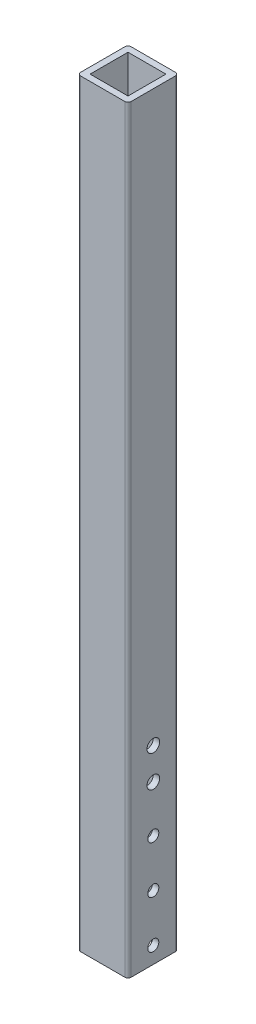
ISO-10303-21;
HEADER;
FILE_DESCRIPTION(('STEP AP214'),'2;1');
FILE_NAME('part.step','',(''),(''),'','','');
FILE_SCHEMA(('AUTOMOTIVE_DESIGN { 1 0 10303 214 1 1 1 1 }'));
ENDSEC;
DATA;
#1=APPLICATION_CONTEXT('core data for automotive mechanical design processes');
#2=APPLICATION_PROTOCOL_DEFINITION('international standard','automotive_design',2000,#1);
#3=PRODUCT_CONTEXT('',#1,'mechanical');
#4=PRODUCT('Part','Part','',(#3));
#5=PRODUCT_RELATED_PRODUCT_CATEGORY('part','',(#4));
#6=PRODUCT_DEFINITION_FORMATION('','',#4);
#7=PRODUCT_DEFINITION_CONTEXT('part definition',#1,'design');
#8=PRODUCT_DEFINITION('design','',#6,#7);
#9=PRODUCT_DEFINITION_SHAPE('','',#8);
#10=(LENGTH_UNIT() NAMED_UNIT(*) SI_UNIT(.MILLI.,.METRE.));
#11=(NAMED_UNIT(*) PLANE_ANGLE_UNIT() SI_UNIT($,.RADIAN.));
#12=(NAMED_UNIT(*) SI_UNIT($,.STERADIAN.) SOLID_ANGLE_UNIT());
#13=UNCERTAINTY_MEASURE_WITH_UNIT(LENGTH_MEASURE(1.E-05),#10,'distance_accuracy_value','');
#14=(GEOMETRIC_REPRESENTATION_CONTEXT(3) GLOBAL_UNCERTAINTY_ASSIGNED_CONTEXT((#13)) GLOBAL_UNIT_ASSIGNED_CONTEXT((#10,
#11,#12)) REPRESENTATION_CONTEXT('',''));
#15=CARTESIAN_POINT('',(0.,0.,0.));
#16=DIRECTION('',(0.,0.,1.));
#17=DIRECTION('',(1.,0.,0.));
#18=AXIS2_PLACEMENT_3D('',#15,#16,#17);
#19=CARTESIAN_POINT('',(0.,240.,0.));
#20=DIRECTION('',(0.,1.,0.));
#21=DIRECTION('',(0.,0.,1.));
#22=AXIS2_PLACEMENT_3D('',#19,#20,#21);
#23=PLANE('',#22);
#24=DIRECTION('',(0.,0.,1.));
#25=VECTOR('',#24,1.);
#26=CARTESIAN_POINT('',(-5.75438596491226,240.,-6.31578947368421));
#27=LINE('',#26,#25);
#28=CARTESIAN_POINT('',(-5.75438596491226,240.,-5.31578947368421));
#29=VERTEX_POINT('',#28);
#30=CARTESIAN_POINT('',(-5.75438596491226,240.,8.68421052631579));
#31=VERTEX_POINT('',#30);
#32=EDGE_CURVE('E194',#29,#31,#27,.T.);
#33=ORIENTED_EDGE('',*,*,#32,.T.);
#34=CARTESIAN_POINT('',(-4.75438596491226,240.,8.68421052631579));
#35=DIRECTION('',(0.,1.,0.));
#36=DIRECTION('',(0.,0.,1.));
#37=AXIS2_PLACEMENT_3D('',#34,#35,#36);
#38=CIRCLE('',#37,1.);
#39=CARTESIAN_POINT('',(-4.75438596491226,240.,9.68421052631579));
#40=VERTEX_POINT('',#39);
#41=EDGE_CURVE('E256',#31,#40,#38,.T.);
#42=ORIENTED_EDGE('',*,*,#41,.T.);
#43=DIRECTION('',(1.,0.,0.));
#44=VECTOR('',#43,1.);
#45=CARTESIAN_POINT('',(-5.75438596491226,240.,9.68421052631579));
#46=LINE('',#45,#44);
#47=CARTESIAN_POINT('',(9.24561403508774,240.,9.68421052631579));
#48=VERTEX_POINT('',#47);
#49=EDGE_CURVE('E198',#40,#48,#46,.T.);
#50=ORIENTED_EDGE('',*,*,#49,.T.);
#51=CARTESIAN_POINT('',(9.24561403508774,240.,8.68421052631579));
#52=DIRECTION('',(0.,1.,0.));
#53=DIRECTION('',(0.,0.,1.));
#54=AXIS2_PLACEMENT_3D('',#51,#52,#53);
#55=CIRCLE('',#54,1.);
#56=CARTESIAN_POINT('',(10.2456140350877,240.,8.68421052631579));
#57=VERTEX_POINT('',#56);
#58=EDGE_CURVE('E250',#48,#57,#55,.T.);
#59=ORIENTED_EDGE('',*,*,#58,.T.);
#60=DIRECTION('',(0.,0.,-1.));
#61=VECTOR('',#60,1.);
#62=CARTESIAN_POINT('',(10.2456140350877,240.,-6.31578947368421));
#63=LINE('',#62,#61);
#64=CARTESIAN_POINT('',(10.2456140350877,240.,-5.31578947368421));
#65=VERTEX_POINT('',#64);
#66=EDGE_CURVE('E203',#57,#65,#63,.T.);
#67=ORIENTED_EDGE('',*,*,#66,.T.);
#68=CARTESIAN_POINT('',(9.24561403508774,240.,-5.31578947368421));
#69=DIRECTION('',(0.,1.,0.));
#70=DIRECTION('',(0.,0.,1.));
#71=AXIS2_PLACEMENT_3D('',#68,#69,#70);
#72=CIRCLE('',#71,1.);
#73=CARTESIAN_POINT('',(9.24561403508774,240.,-6.31578947368421));
#74=VERTEX_POINT('',#73);
#75=EDGE_CURVE('E69',#65,#74,#72,.T.);
#76=ORIENTED_EDGE('',*,*,#75,.T.);
#77=DIRECTION('',(-1.,0.,0.));
#78=VECTOR('',#77,1.);
#79=CARTESIAN_POINT('',(-5.75438596491226,240.,-6.31578947368421));
#80=LINE('',#79,#78);
#81=CARTESIAN_POINT('',(-4.75438596491226,240.,-6.31578947368421));
#82=VERTEX_POINT('',#81);
#83=EDGE_CURVE('E206',#74,#82,#80,.T.);
#84=ORIENTED_EDGE('',*,*,#83,.T.);
#85=CARTESIAN_POINT('',(-4.75438596491226,240.,-5.31578947368421));
#86=DIRECTION('',(0.,1.,0.));
#87=DIRECTION('',(0.,0.,1.));
#88=AXIS2_PLACEMENT_3D('',#85,#86,#87);
#89=CIRCLE('',#88,1.);
#90=EDGE_CURVE('E253',#82,#29,#89,.T.);
#91=ORIENTED_EDGE('',*,*,#90,.T.);
#92=EDGE_LOOP('',(#33,#42,#50,#59,#67,#76,#84,#91));
#93=FACE_BOUND('',#92,.T.);
#94=DIRECTION('',(0.,0.,1.));
#95=VECTOR('',#94,1.);
#96=CARTESIAN_POINT('',(-3.75438596491226,240.,-4.31578947368421));
#97=LINE('',#96,#95);
#98=CARTESIAN_POINT('',(-3.75438596491226,240.,-4.31578947368421));
#99=VERTEX_POINT('',#98);
#100=CARTESIAN_POINT('',(-3.75438596491226,240.,7.68421052631579));
#101=VERTEX_POINT('',#100);
#102=EDGE_CURVE('E150',#99,#101,#97,.T.);
#103=ORIENTED_EDGE('',*,*,#102,.F.);
#104=DIRECTION('',(-1.,0.,0.));
#105=VECTOR('',#104,1.);
#106=CARTESIAN_POINT('',(-3.75438596491226,240.,-4.31578947368421));
#107=LINE('',#106,#105);
#108=CARTESIAN_POINT('',(8.24561403508774,240.,-4.31578947368421));
#109=VERTEX_POINT('',#108);
#110=EDGE_CURVE('E139',#109,#99,#107,.T.);
#111=ORIENTED_EDGE('',*,*,#110,.F.);
#112=DIRECTION('',(0.,0.,-1.));
#113=VECTOR('',#112,1.);
#114=CARTESIAN_POINT('',(8.24561403508774,240.,-4.31578947368421));
#115=LINE('',#114,#113);
#116=CARTESIAN_POINT('',(8.24561403508774,240.,7.68421052631579));
#117=VERTEX_POINT('',#116);
#118=EDGE_CURVE('E168',#117,#109,#115,.T.);
#119=ORIENTED_EDGE('',*,*,#118,.F.);
#120=DIRECTION('',(1.,0.,0.));
#121=VECTOR('',#120,1.);
#122=CARTESIAN_POINT('',(-3.75438596491226,240.,7.68421052631579));
#123=LINE('',#122,#121);
#124=EDGE_CURVE('E164',#101,#117,#123,.T.);
#125=ORIENTED_EDGE('',*,*,#124,.F.);
#126=EDGE_LOOP('',(#103,#111,#119,#125));
#127=FACE_BOUND('',#126,.T.);
#128=ADVANCED_FACE('F44',(#93,#127),#23,.T.);
#129=CARTESIAN_POINT('',(0.,0.,0.));
#130=DIRECTION('',(0.,1.,0.));
#131=DIRECTION('',(0.,0.,1.));
#132=AXIS2_PLACEMENT_3D('',#129,#130,#131);
#133=PLANE('',#132);
#134=DIRECTION('',(1.,0.,0.));
#135=VECTOR('',#134,1.);
#136=CARTESIAN_POINT('',(-5.75438596491226,0.,9.68421052631579));
#137=LINE('',#136,#135);
#138=CARTESIAN_POINT('',(-4.75438596491226,0.,9.68421052631579));
#139=VERTEX_POINT('',#138);
#140=CARTESIAN_POINT('',(9.24561403508774,0.,9.68421052631579));
#141=VERTEX_POINT('',#140);
#142=EDGE_CURVE('E213',#139,#141,#137,.T.);
#143=ORIENTED_EDGE('',*,*,#142,.F.);
#144=CARTESIAN_POINT('',(-4.75438596491226,0.,8.68421052631579));
#145=DIRECTION('',(0.,1.,0.));
#146=DIRECTION('',(0.,0.,1.));
#147=AXIS2_PLACEMENT_3D('',#144,#145,#146);
#148=CIRCLE('',#147,1.);
#149=CARTESIAN_POINT('',(-5.75438596491226,0.,8.68421052631579));
#150=VERTEX_POINT('',#149);
#151=EDGE_CURVE('E238',#139,#150,#148,.F.);
#152=ORIENTED_EDGE('',*,*,#151,.T.);
#153=DIRECTION('',(0.,0.,1.));
#154=VECTOR('',#153,1.);
#155=CARTESIAN_POINT('',(-5.75438596491226,0.,-6.31578947368421));
#156=LINE('',#155,#154);
#157=CARTESIAN_POINT('',(-5.75438596491226,0.,-5.31578947368421));
#158=VERTEX_POINT('',#157);
#159=EDGE_CURVE('E159',#158,#150,#156,.T.);
#160=ORIENTED_EDGE('',*,*,#159,.F.);
#161=CARTESIAN_POINT('',(-4.75438596491226,0.,-5.31578947368421));
#162=DIRECTION('',(0.,1.,0.));
#163=DIRECTION('',(0.,0.,1.));
#164=AXIS2_PLACEMENT_3D('',#161,#162,#163);
#165=CIRCLE('',#164,1.);
#166=CARTESIAN_POINT('',(-4.75438596491226,0.,-6.31578947368421));
#167=VERTEX_POINT('',#166);
#168=EDGE_CURVE('E235',#158,#167,#165,.F.);
#169=ORIENTED_EDGE('',*,*,#168,.T.);
#170=DIRECTION('',(-1.,0.,0.));
#171=VECTOR('',#170,1.);
#172=CARTESIAN_POINT('',(-5.75438596491226,0.,-6.31578947368421));
#173=LINE('',#172,#171);
#174=CARTESIAN_POINT('',(9.24561403508774,0.,-6.31578947368421));
#175=VERTEX_POINT('',#174);
#176=EDGE_CURVE('E199',#175,#167,#173,.T.);
#177=ORIENTED_EDGE('',*,*,#176,.F.);
#178=CARTESIAN_POINT('',(9.24561403508774,0.,-5.31578947368421));
#179=DIRECTION('',(0.,1.,0.));
#180=DIRECTION('',(0.,0.,1.));
#181=AXIS2_PLACEMENT_3D('',#178,#179,#180);
#182=CIRCLE('',#181,1.);
#183=CARTESIAN_POINT('',(10.2456140350877,0.,-5.31578947368421));
#184=VERTEX_POINT('',#183);
#185=EDGE_CURVE('E229',#175,#184,#182,.F.);
#186=ORIENTED_EDGE('',*,*,#185,.T.);
#187=DIRECTION('',(0.,0.,-1.));
#188=VECTOR('',#187,1.);
#189=CARTESIAN_POINT('',(10.2456140350877,0.,-6.31578947368421));
#190=LINE('',#189,#188);
#191=CARTESIAN_POINT('',(10.2456140350877,0.,8.68421052631579));
#192=VERTEX_POINT('',#191);
#193=EDGE_CURVE('E217',#192,#184,#190,.T.);
#194=ORIENTED_EDGE('',*,*,#193,.F.);
#195=CARTESIAN_POINT('',(9.24561403508774,0.,8.68421052631579));
#196=DIRECTION('',(0.,1.,0.));
#197=DIRECTION('',(0.,0.,1.));
#198=AXIS2_PLACEMENT_3D('',#195,#196,#197);
#199=CIRCLE('',#198,1.);
#200=EDGE_CURVE('E232',#192,#141,#199,.F.);
#201=ORIENTED_EDGE('',*,*,#200,.T.);
#202=EDGE_LOOP('',(#143,#152,#160,#169,#177,#186,#194,#201));
#203=FACE_BOUND('',#202,.T.);
#204=DIRECTION('',(-1.,0.,0.));
#205=VECTOR('',#204,1.);
#206=CARTESIAN_POINT('',(-3.75438596491226,0.,-4.31578947368421));
#207=LINE('',#206,#205);
#208=CARTESIAN_POINT('',(8.24561403508774,0.,-4.31578947368421));
#209=VERTEX_POINT('',#208);
#210=CARTESIAN_POINT('',(-3.75438596491226,0.,-4.31578947368421));
#211=VERTEX_POINT('',#210);
#212=EDGE_CURVE('E174',#209,#211,#207,.T.);
#213=ORIENTED_EDGE('',*,*,#212,.T.);
#214=DIRECTION('',(0.,0.,1.));
#215=VECTOR('',#214,1.);
#216=CARTESIAN_POINT('',(-3.75438596491226,0.,-4.31578947368421));
#217=LINE('',#216,#215);
#218=CARTESIAN_POINT('',(-3.75438596491226,0.,7.68421052631579));
#219=VERTEX_POINT('',#218);
#220=EDGE_CURVE('E157',#211,#219,#217,.T.);
#221=ORIENTED_EDGE('',*,*,#220,.T.);
#222=DIRECTION('',(1.,0.,0.));
#223=VECTOR('',#222,1.);
#224=CARTESIAN_POINT('',(-3.75438596491226,0.,7.68421052631579));
#225=LINE('',#224,#223);
#226=CARTESIAN_POINT('',(8.24561403508774,0.,7.68421052631579));
#227=VERTEX_POINT('',#226);
#228=EDGE_CURVE('E180',#219,#227,#225,.T.);
#229=ORIENTED_EDGE('',*,*,#228,.T.);
#230=DIRECTION('',(0.,0.,-1.));
#231=VECTOR('',#230,1.);
#232=CARTESIAN_POINT('',(8.24561403508774,0.,-4.31578947368421));
#233=LINE('',#232,#231);
#234=EDGE_CURVE('E151',#227,#209,#233,.T.);
#235=ORIENTED_EDGE('',*,*,#234,.T.);
#236=EDGE_LOOP('',(#213,#221,#229,#235));
#237=FACE_BOUND('',#236,.T.);
#238=ADVANCED_FACE('F370',(#203,#237),#133,.F.);
#239=CARTESIAN_POINT('',(-5.75438596491226,240.,-6.31578947368421));
#240=DIRECTION('',(1.,0.,0.));
#241=DIRECTION('',(0.,0.,-1.));
#242=AXIS2_PLACEMENT_3D('',#239,#240,#241);
#243=PLANE('',#242);
#244=CARTESIAN_POINT('',(-5.75438596491226,60.,1.68421052631579));
#245=DIRECTION('',(1.,0.,0.));
#246=DIRECTION('',(0.,0.,-1.));
#247=AXIS2_PLACEMENT_3D('',#244,#245,#246);
#248=CIRCLE('',#247,2.);
#249=CARTESIAN_POINT('',(-5.75438596491226,60.,-0.315789473684212));
#250=VERTEX_POINT('',#249);
#251=EDGE_CURVE('E312',#250,#250,#248,.T.);
#252=ORIENTED_EDGE('',*,*,#251,.T.);
#253=EDGE_LOOP('',(#252));
#254=FACE_BOUND('',#253,.T.);
#255=CARTESIAN_POINT('',(-5.75438596491226,50.,1.68421052631579));
#256=DIRECTION('',(1.,0.,0.));
#257=DIRECTION('',(0.,0.,-1.));
#258=AXIS2_PLACEMENT_3D('',#255,#256,#257);
#259=CIRCLE('',#258,2.);
#260=CARTESIAN_POINT('',(-5.75438596491226,50.,-0.315789473684212));
#261=VERTEX_POINT('',#260);
#262=EDGE_CURVE('E294',#261,#261,#259,.T.);
#263=ORIENTED_EDGE('',*,*,#262,.T.);
#264=EDGE_LOOP('',(#263));
#265=FACE_BOUND('',#264,.T.);
#266=CARTESIAN_POINT('',(-5.75438596491226,35.25,1.68421052631579));
#267=DIRECTION('',(1.,0.,0.));
#268=DIRECTION('',(0.,0.,-1.));
#269=AXIS2_PLACEMENT_3D('',#266,#267,#268);
#270=CIRCLE('',#269,1.75);
#271=CARTESIAN_POINT('',(-5.75438596491226,35.25,-0.0657894736842137));
#272=VERTEX_POINT('',#271);
#273=EDGE_CURVE('E177',#272,#272,#270,.T.);
#274=ORIENTED_EDGE('',*,*,#273,.T.);
#275=EDGE_LOOP('',(#274));
#276=FACE_BOUND('',#275,.T.);
#277=CARTESIAN_POINT('',(-5.75438596491226,5.25,1.68421052631579));
#278=DIRECTION('',(1.,0.,0.));
#279=DIRECTION('',(0.,0.,-1.));
#280=AXIS2_PLACEMENT_3D('',#277,#278,#279);
#281=CIRCLE('',#280,1.75);
#282=CARTESIAN_POINT('',(-5.75438596491226,5.25,-0.0657894736842126));
#283=VERTEX_POINT('',#282);
#284=EDGE_CURVE('E283',#283,#283,#281,.T.);
#285=ORIENTED_EDGE('',*,*,#284,.T.);
#286=EDGE_LOOP('',(#285));
#287=FACE_BOUND('',#286,.T.);
#288=CARTESIAN_POINT('',(-5.75438596491226,20.25,1.68421052631579));
#289=DIRECTION('',(1.,0.,0.));
#290=DIRECTION('',(0.,0.,-1.));
#291=AXIS2_PLACEMENT_3D('',#288,#289,#290);
#292=CIRCLE('',#291,1.75);
#293=CARTESIAN_POINT('',(-5.75438596491226,20.25,-0.0657894736842142));
#294=VERTEX_POINT('',#293);
#295=EDGE_CURVE('E278',#294,#294,#292,.T.);
#296=ORIENTED_EDGE('',*,*,#295,.T.);
#297=EDGE_LOOP('',(#296));
#298=FACE_BOUND('',#297,.T.);
#299=ORIENTED_EDGE('',*,*,#159,.T.);
#300=DIRECTION('',(0.,-1.,0.));
#301=VECTOR('',#300,1.);
#302=CARTESIAN_POINT('',(-5.75438596491226,240.,8.68421052631579));
#303=LINE('',#302,#301);
#304=EDGE_CURVE('E245',#150,#31,#303,.F.);
#305=ORIENTED_EDGE('',*,*,#304,.T.);
#306=ORIENTED_EDGE('',*,*,#32,.F.);
#307=DIRECTION('',(0.,-1.,0.));
#308=VECTOR('',#307,1.);
#309=CARTESIAN_POINT('',(-5.75438596491226,240.,-5.31578947368421));
#310=LINE('',#309,#308);
#311=EDGE_CURVE('E241',#29,#158,#310,.T.);
#312=ORIENTED_EDGE('',*,*,#311,.T.);
#313=EDGE_LOOP('',(#299,#305,#306,#312));
#314=FACE_BOUND('',#313,.T.);
#315=ADVANCED_FACE('F345',(#254,#265,#276,#287,#298,#314),#243,.F.);
#316=CARTESIAN_POINT('',(-5.75438596491226,240.,9.68421052631579));
#317=DIRECTION('',(0.,0.,-1.));
#318=DIRECTION('',(-1.,0.,0.));
#319=AXIS2_PLACEMENT_3D('',#316,#317,#318);
#320=PLANE('',#319);
#321=ORIENTED_EDGE('',*,*,#49,.F.);
#322=DIRECTION('',(0.,-1.,0.));
#323=VECTOR('',#322,1.);
#324=CARTESIAN_POINT('',(-4.75438596491226,240.,9.68421052631579));
#325=LINE('',#324,#323);
#326=EDGE_CURVE('E225',#40,#139,#325,.T.);
#327=ORIENTED_EDGE('',*,*,#326,.T.);
#328=ORIENTED_EDGE('',*,*,#142,.T.);
#329=DIRECTION('',(0.,-1.,0.));
#330=VECTOR('',#329,1.);
#331=CARTESIAN_POINT('',(9.24561403508774,240.,9.68421052631579));
#332=LINE('',#331,#330);
#333=EDGE_CURVE('E209',#141,#48,#332,.F.);
#334=ORIENTED_EDGE('',*,*,#333,.T.);
#335=EDGE_LOOP('',(#321,#327,#328,#334));
#336=FACE_BOUND('',#335,.T.);
#337=ADVANCED_FACE('F387',(#336),#320,.F.);
#338=CARTESIAN_POINT('',(10.2456140350877,240.,-6.31578947368421));
#339=DIRECTION('',(-1.,0.,0.));
#340=DIRECTION('',(0.,0.,1.));
#341=AXIS2_PLACEMENT_3D('',#338,#339,#340);
#342=PLANE('',#341);
#343=CARTESIAN_POINT('',(10.2456140350877,60.,1.68421052631579));
#344=DIRECTION('',(1.,0.,0.));
#345=DIRECTION('',(0.,0.,-1.));
#346=AXIS2_PLACEMENT_3D('',#343,#344,#345);
#347=CIRCLE('',#346,2.);
#348=CARTESIAN_POINT('',(10.2456140350877,60.,-0.315789473684212));
#349=VERTEX_POINT('',#348);
#350=EDGE_CURVE('E288',#349,#349,#347,.T.);
#351=ORIENTED_EDGE('',*,*,#350,.F.);
#352=EDGE_LOOP('',(#351));
#353=FACE_BOUND('',#352,.T.);
#354=CARTESIAN_POINT('',(10.2456140350877,50.,1.68421052631579));
#355=DIRECTION('',(1.,0.,0.));
#356=DIRECTION('',(0.,0.,-1.));
#357=AXIS2_PLACEMENT_3D('',#354,#355,#356);
#358=CIRCLE('',#357,2.);
#359=CARTESIAN_POINT('',(10.2456140350877,50.,-0.315789473684212));
#360=VERTEX_POINT('',#359);
#361=EDGE_CURVE('E297',#360,#360,#358,.T.);
#362=ORIENTED_EDGE('',*,*,#361,.F.);
#363=EDGE_LOOP('',(#362));
#364=FACE_BOUND('',#363,.T.);
#365=CARTESIAN_POINT('',(10.2456140350877,35.25,1.68421052631579));
#366=DIRECTION('',(1.,0.,0.));
#367=DIRECTION('',(0.,0.,-1.));
#368=AXIS2_PLACEMENT_3D('',#365,#366,#367);
#369=CIRCLE('',#368,1.75);
#370=CARTESIAN_POINT('',(10.2456140350877,35.25,-0.0657894736842137));
#371=VERTEX_POINT('',#370);
#372=EDGE_CURVE('E272',#371,#371,#369,.T.);
#373=ORIENTED_EDGE('',*,*,#372,.F.);
#374=EDGE_LOOP('',(#373));
#375=FACE_BOUND('',#374,.T.);
#376=CARTESIAN_POINT('',(10.2456140350877,5.25,1.68421052631579));
#377=DIRECTION('',(1.,0.,0.));
#378=DIRECTION('',(0.,0.,-1.));
#379=AXIS2_PLACEMENT_3D('',#376,#377,#378);
#380=CIRCLE('',#379,1.75);
#381=CARTESIAN_POINT('',(10.2456140350877,5.25,-0.0657894736842126));
#382=VERTEX_POINT('',#381);
#383=EDGE_CURVE('E320',#382,#382,#380,.T.);
#384=ORIENTED_EDGE('',*,*,#383,.F.);
#385=EDGE_LOOP('',(#384));
#386=FACE_BOUND('',#385,.T.);
#387=CARTESIAN_POINT('',(10.2456140350877,20.25,1.68421052631579));
#388=DIRECTION('',(1.,0.,0.));
#389=DIRECTION('',(0.,0.,-1.));
#390=AXIS2_PLACEMENT_3D('',#387,#388,#389);
#391=CIRCLE('',#390,1.75);
#392=CARTESIAN_POINT('',(10.2456140350877,20.25,-0.0657894736842142));
#393=VERTEX_POINT('',#392);
#394=EDGE_CURVE('E316',#393,#393,#391,.T.);
#395=ORIENTED_EDGE('',*,*,#394,.F.);
#396=EDGE_LOOP('',(#395));
#397=FACE_BOUND('',#396,.T.);
#398=ORIENTED_EDGE('',*,*,#66,.F.);
#399=DIRECTION('',(0.,-1.,0.));
#400=VECTOR('',#399,1.);
#401=CARTESIAN_POINT('',(10.2456140350877,240.,8.68421052631579));
#402=LINE('',#401,#400);
#403=EDGE_CURVE('E11',#57,#192,#402,.T.);
#404=ORIENTED_EDGE('',*,*,#403,.T.);
#405=ORIENTED_EDGE('',*,*,#193,.T.);
#406=DIRECTION('',(0.,-1.,0.));
#407=VECTOR('',#406,1.);
#408=CARTESIAN_POINT('',(10.2456140350877,240.,-5.31578947368421));
#409=LINE('',#408,#407);
#410=EDGE_CURVE('E54',#184,#65,#409,.F.);
#411=ORIENTED_EDGE('',*,*,#410,.T.);
#412=EDGE_LOOP('',(#398,#404,#405,#411));
#413=FACE_BOUND('',#412,.T.);
#414=ADVANCED_FACE('F384',(#353,#364,#375,#386,#397,#413),#342,.F.);
#415=CARTESIAN_POINT('',(-5.75438596491226,240.,-6.31578947368421));
#416=DIRECTION('',(0.,0.,1.));
#417=DIRECTION('',(1.,0.,0.));
#418=AXIS2_PLACEMENT_3D('',#415,#416,#417);
#419=PLANE('',#418);
#420=ORIENTED_EDGE('',*,*,#176,.T.);
#421=DIRECTION('',(0.,-1.,0.));
#422=VECTOR('',#421,1.);
#423=CARTESIAN_POINT('',(-4.75438596491226,240.,-6.31578947368421));
#424=LINE('',#423,#422);
#425=EDGE_CURVE('E62',#167,#82,#424,.F.);
#426=ORIENTED_EDGE('',*,*,#425,.T.);
#427=ORIENTED_EDGE('',*,*,#83,.F.);
#428=DIRECTION('',(0.,-1.,0.));
#429=VECTOR('',#428,1.);
#430=CARTESIAN_POINT('',(9.24561403508774,240.,-6.31578947368421));
#431=LINE('',#430,#429);
#432=EDGE_CURVE('E259',#74,#175,#431,.T.);
#433=ORIENTED_EDGE('',*,*,#432,.T.);
#434=EDGE_LOOP('',(#420,#426,#427,#433));
#435=FACE_BOUND('',#434,.T.);
#436=ADVANCED_FACE('F381',(#435),#419,.F.);
#437=CARTESIAN_POINT('',(-3.75438596491226,240.,-4.31578947368421));
#438=DIRECTION('',(0.,0.,1.));
#439=DIRECTION('',(1.,0.,0.));
#440=AXIS2_PLACEMENT_3D('',#437,#438,#439);
#441=PLANE('',#440);
#442=ORIENTED_EDGE('',*,*,#212,.F.);
#443=DIRECTION('',(0.,-1.,0.));
#444=VECTOR('',#443,1.);
#445=CARTESIAN_POINT('',(8.24561403508774,240.,-4.31578947368421));
#446=LINE('',#445,#444);
#447=EDGE_CURVE('E145',#109,#209,#446,.T.);
#448=ORIENTED_EDGE('',*,*,#447,.F.);
#449=ORIENTED_EDGE('',*,*,#110,.T.);
#450=DIRECTION('',(0.,-1.,0.));
#451=VECTOR('',#450,1.);
#452=CARTESIAN_POINT('',(-3.75438596491226,240.,-4.31578947368421));
#453=LINE('',#452,#451);
#454=EDGE_CURVE('E142',#99,#211,#453,.T.);
#455=ORIENTED_EDGE('',*,*,#454,.T.);
#456=EDGE_LOOP('',(#442,#448,#449,#455));
#457=FACE_BOUND('',#456,.T.);
#458=ADVANCED_FACE('F141',(#457),#441,.T.);
#459=CARTESIAN_POINT('',(-3.75438596491226,240.,-4.31578947368421));
#460=DIRECTION('',(1.,0.,0.));
#461=DIRECTION('',(0.,0.,-1.));
#462=AXIS2_PLACEMENT_3D('',#459,#460,#461);
#463=PLANE('',#462);
#464=CARTESIAN_POINT('',(-3.75438596491226,60.,1.68421052631579));
#465=DIRECTION('',(1.,0.,0.));
#466=DIRECTION('',(0.,0.,-1.));
#467=AXIS2_PLACEMENT_3D('',#464,#465,#466);
#468=CIRCLE('',#467,2.);
#469=CARTESIAN_POINT('',(-3.75438596491226,60.,-0.315789473684212));
#470=VERTEX_POINT('',#469);
#471=EDGE_CURVE('E308',#470,#470,#468,.T.);
#472=ORIENTED_EDGE('',*,*,#471,.F.);
#473=EDGE_LOOP('',(#472));
#474=FACE_BOUND('',#473,.T.);
#475=CARTESIAN_POINT('',(-3.75438596491226,50.,1.68421052631579));
#476=DIRECTION('',(1.,0.,0.));
#477=DIRECTION('',(0.,0.,-1.));
#478=AXIS2_PLACEMENT_3D('',#475,#476,#477);
#479=CIRCLE('',#478,2.);
#480=CARTESIAN_POINT('',(-3.75438596491226,50.,-0.315789473684212));
#481=VERTEX_POINT('',#480);
#482=EDGE_CURVE('E287',#481,#481,#479,.T.);
#483=ORIENTED_EDGE('',*,*,#482,.F.);
#484=EDGE_LOOP('',(#483));
#485=FACE_BOUND('',#484,.T.);
#486=CARTESIAN_POINT('',(-3.75438596491226,35.25,1.68421052631579));
#487=DIRECTION('',(1.,0.,0.));
#488=DIRECTION('',(0.,0.,-1.));
#489=AXIS2_PLACEMENT_3D('',#486,#487,#488);
#490=CIRCLE('',#489,1.75);
#491=CARTESIAN_POINT('',(-3.75438596491226,35.25,-0.0657894736842137));
#492=VERTEX_POINT('',#491);
#493=EDGE_CURVE('E282',#492,#492,#490,.T.);
#494=ORIENTED_EDGE('',*,*,#493,.F.);
#495=EDGE_LOOP('',(#494));
#496=FACE_BOUND('',#495,.T.);
#497=CARTESIAN_POINT('',(-3.75438596491226,5.25,1.68421052631579));
#498=DIRECTION('',(1.,0.,0.));
#499=DIRECTION('',(0.,0.,-1.));
#500=AXIS2_PLACEMENT_3D('',#497,#498,#499);
#501=CIRCLE('',#500,1.75);
#502=CARTESIAN_POINT('',(-3.75438596491226,5.25,-0.0657894736842126));
#503=VERTEX_POINT('',#502);
#504=EDGE_CURVE('E277',#503,#503,#501,.T.);
#505=ORIENTED_EDGE('',*,*,#504,.F.);
#506=EDGE_LOOP('',(#505));
#507=FACE_BOUND('',#506,.T.);
#508=CARTESIAN_POINT('',(-3.75438596491226,20.25,1.68421052631579));
#509=DIRECTION('',(1.,0.,0.));
#510=DIRECTION('',(0.,0.,-1.));
#511=AXIS2_PLACEMENT_3D('',#508,#509,#510);
#512=CIRCLE('',#511,1.75);
#513=CARTESIAN_POINT('',(-3.75438596491226,20.25,-0.0657894736842142));
#514=VERTEX_POINT('',#513);
#515=EDGE_CURVE('E271',#514,#514,#512,.T.);
#516=ORIENTED_EDGE('',*,*,#515,.F.);
#517=EDGE_LOOP('',(#516));
#518=FACE_BOUND('',#517,.T.);
#519=ORIENTED_EDGE('',*,*,#220,.F.);
#520=ORIENTED_EDGE('',*,*,#454,.F.);
#521=ORIENTED_EDGE('',*,*,#102,.T.);
#522=DIRECTION('',(0.,-1.,0.));
#523=VECTOR('',#522,1.);
#524=CARTESIAN_POINT('',(-3.75438596491226,240.,7.68421052631579));
#525=LINE('',#524,#523);
#526=EDGE_CURVE('E160',#101,#219,#525,.T.);
#527=ORIENTED_EDGE('',*,*,#526,.T.);
#528=EDGE_LOOP('',(#519,#520,#521,#527));
#529=FACE_BOUND('',#528,.T.);
#530=ADVANCED_FACE('F154',(#474,#485,#496,#507,#518,#529),#463,.T.);
#531=CARTESIAN_POINT('',(-3.75438596491226,240.,7.68421052631579));
#532=DIRECTION('',(0.,0.,-1.));
#533=DIRECTION('',(-1.,0.,0.));
#534=AXIS2_PLACEMENT_3D('',#531,#532,#533);
#535=PLANE('',#534);
#536=ORIENTED_EDGE('',*,*,#228,.F.);
#537=ORIENTED_EDGE('',*,*,#526,.F.);
#538=ORIENTED_EDGE('',*,*,#124,.T.);
#539=DIRECTION('',(0.,-1.,0.));
#540=VECTOR('',#539,1.);
#541=CARTESIAN_POINT('',(8.24561403508774,240.,7.68421052631579));
#542=LINE('',#541,#540);
#543=EDGE_CURVE('E189',#117,#227,#542,.T.);
#544=ORIENTED_EDGE('',*,*,#543,.T.);
#545=EDGE_LOOP('',(#536,#537,#538,#544));
#546=FACE_BOUND('',#545,.T.);
#547=ADVANCED_FACE('F434',(#546),#535,.T.);
#548=CARTESIAN_POINT('',(8.24561403508774,240.,-4.31578947368421));
#549=DIRECTION('',(-1.,0.,0.));
#550=DIRECTION('',(0.,0.,1.));
#551=AXIS2_PLACEMENT_3D('',#548,#549,#550);
#552=PLANE('',#551);
#553=CARTESIAN_POINT('',(8.24561403508774,60.,1.68421052631579));
#554=DIRECTION('',(-1.,0.,0.));
#555=DIRECTION('',(0.,0.,1.));
#556=AXIS2_PLACEMENT_3D('',#553,#554,#555);
#557=CIRCLE('',#556,2.);
#558=CARTESIAN_POINT('',(8.24561403508774,60.,3.68421052631579));
#559=VERTEX_POINT('',#558);
#560=EDGE_CURVE('E48',#559,#559,#557,.T.);
#561=ORIENTED_EDGE('',*,*,#560,.F.);
#562=EDGE_LOOP('',(#561));
#563=FACE_BOUND('',#562,.T.);
#564=CARTESIAN_POINT('',(8.24561403508774,50.,1.68421052631579));
#565=DIRECTION('',(-1.,0.,0.));
#566=DIRECTION('',(0.,0.,1.));
#567=AXIS2_PLACEMENT_3D('',#564,#565,#566);
#568=CIRCLE('',#567,2.);
#569=CARTESIAN_POINT('',(8.24561403508774,50.,3.68421052631579));
#570=VERTEX_POINT('',#569);
#571=EDGE_CURVE('E284',#570,#570,#568,.T.);
#572=ORIENTED_EDGE('',*,*,#571,.F.);
#573=EDGE_LOOP('',(#572));
#574=FACE_BOUND('',#573,.T.);
#575=CARTESIAN_POINT('',(8.24561403508774,35.25,1.68421052631579));
#576=DIRECTION('',(-1.,0.,0.));
#577=DIRECTION('',(0.,0.,1.));
#578=AXIS2_PLACEMENT_3D('',#575,#576,#577);
#579=CIRCLE('',#578,1.75);
#580=CARTESIAN_POINT('',(8.24561403508774,35.25,3.43421052631579));
#581=VERTEX_POINT('',#580);
#582=EDGE_CURVE('E279',#581,#581,#579,.T.);
#583=ORIENTED_EDGE('',*,*,#582,.F.);
#584=EDGE_LOOP('',(#583));
#585=FACE_BOUND('',#584,.T.);
#586=CARTESIAN_POINT('',(8.24561403508774,5.25,1.68421052631579));
#587=DIRECTION('',(-1.,0.,0.));
#588=DIRECTION('',(0.,0.,1.));
#589=AXIS2_PLACEMENT_3D('',#586,#587,#588);
#590=CIRCLE('',#589,1.75);
#591=CARTESIAN_POINT('',(8.24561403508774,5.25,3.43421052631579));
#592=VERTEX_POINT('',#591);
#593=EDGE_CURVE('E273',#592,#592,#590,.T.);
#594=ORIENTED_EDGE('',*,*,#593,.F.);
#595=EDGE_LOOP('',(#594));
#596=FACE_BOUND('',#595,.T.);
#597=CARTESIAN_POINT('',(8.24561403508774,20.25,1.68421052631579));
#598=DIRECTION('',(-1.,0.,0.));
#599=DIRECTION('',(0.,0.,1.));
#600=AXIS2_PLACEMENT_3D('',#597,#598,#599);
#601=CIRCLE('',#600,1.75);
#602=CARTESIAN_POINT('',(8.24561403508774,20.25,3.43421052631579));
#603=VERTEX_POINT('',#602);
#604=EDGE_CURVE('E267',#603,#603,#601,.T.);
#605=ORIENTED_EDGE('',*,*,#604,.F.);
#606=EDGE_LOOP('',(#605));
#607=FACE_BOUND('',#606,.T.);
#608=ORIENTED_EDGE('',*,*,#234,.F.);
#609=ORIENTED_EDGE('',*,*,#543,.F.);
#610=ORIENTED_EDGE('',*,*,#118,.T.);
#611=ORIENTED_EDGE('',*,*,#447,.T.);
#612=EDGE_LOOP('',(#608,#609,#610,#611));
#613=FACE_BOUND('',#612,.T.);
#614=ADVANCED_FACE('F398',(#563,#574,#585,#596,#607,#613),#552,.T.);
#615=CARTESIAN_POINT('',(-4.75438596491226,240.,8.68421052631579));
#616=DIRECTION('',(0.,-1.,0.));
#617=DIRECTION('',(0.,0.,-1.));
#618=AXIS2_PLACEMENT_3D('',#615,#616,#617);
#619=CYLINDRICAL_SURFACE('',#618,1.);
#620=ORIENTED_EDGE('',*,*,#41,.F.);
#621=ORIENTED_EDGE('',*,*,#304,.F.);
#622=ORIENTED_EDGE('',*,*,#151,.F.);
#623=ORIENTED_EDGE('',*,*,#326,.F.);
#624=EDGE_LOOP('',(#620,#621,#622,#623));
#625=FACE_BOUND('',#624,.T.);
#626=ADVANCED_FACE('F394',(#625),#619,.T.);
#627=CARTESIAN_POINT('',(-4.75438596491226,240.,-5.31578947368421));
#628=DIRECTION('',(0.,-1.,0.));
#629=DIRECTION('',(0.,0.,-1.));
#630=AXIS2_PLACEMENT_3D('',#627,#628,#629);
#631=CYLINDRICAL_SURFACE('',#630,1.);
#632=ORIENTED_EDGE('',*,*,#90,.F.);
#633=ORIENTED_EDGE('',*,*,#425,.F.);
#634=ORIENTED_EDGE('',*,*,#168,.F.);
#635=ORIENTED_EDGE('',*,*,#311,.F.);
#636=EDGE_LOOP('',(#632,#633,#634,#635));
#637=FACE_BOUND('',#636,.T.);
#638=ADVANCED_FACE('F397',(#637),#631,.T.);
#639=CARTESIAN_POINT('',(9.24561403508774,240.,8.68421052631579));
#640=DIRECTION('',(0.,-1.,0.));
#641=DIRECTION('',(0.,0.,-1.));
#642=AXIS2_PLACEMENT_3D('',#639,#640,#641);
#643=CYLINDRICAL_SURFACE('',#642,1.);
#644=ORIENTED_EDGE('',*,*,#58,.F.);
#645=ORIENTED_EDGE('',*,*,#333,.F.);
#646=ORIENTED_EDGE('',*,*,#200,.F.);
#647=ORIENTED_EDGE('',*,*,#403,.F.);
#648=EDGE_LOOP('',(#644,#645,#646,#647));
#649=FACE_BOUND('',#648,.T.);
#650=ADVANCED_FACE('F401',(#649),#643,.T.);
#651=CARTESIAN_POINT('',(9.24561403508774,240.,-5.31578947368421));
#652=DIRECTION('',(0.,-1.,0.));
#653=DIRECTION('',(0.,0.,-1.));
#654=AXIS2_PLACEMENT_3D('',#651,#652,#653);
#655=CYLINDRICAL_SURFACE('',#654,1.);
#656=ORIENTED_EDGE('',*,*,#75,.F.);
#657=ORIENTED_EDGE('',*,*,#410,.F.);
#658=ORIENTED_EDGE('',*,*,#185,.F.);
#659=ORIENTED_EDGE('',*,*,#432,.F.);
#660=EDGE_LOOP('',(#656,#657,#658,#659));
#661=FACE_BOUND('',#660,.T.);
#662=ADVANCED_FACE('F46',(#661),#655,.T.);
#663=CARTESIAN_POINT('',(-9.75438596491226,20.25,1.68421052631579));
#664=DIRECTION('',(1.,0.,0.));
#665=DIRECTION('',(0.,0.,-1.));
#666=AXIS2_PLACEMENT_3D('',#663,#664,#665);
#667=CYLINDRICAL_SURFACE('',#666,1.75);
#668=ORIENTED_EDGE('',*,*,#604,.T.);
#669=EDGE_LOOP('',(#668));
#670=FACE_BOUND('',#669,.T.);
#671=ORIENTED_EDGE('',*,*,#394,.T.);
#672=EDGE_LOOP('',(#671));
#673=FACE_BOUND('',#672,.T.);
#674=ADVANCED_FACE('F408',(#670,#673),#667,.F.);
#675=CARTESIAN_POINT('',(-9.75438596491226,5.25,1.68421052631579));
#676=DIRECTION('',(1.,0.,0.));
#677=DIRECTION('',(0.,0.,-1.));
#678=AXIS2_PLACEMENT_3D('',#675,#676,#677);
#679=CYLINDRICAL_SURFACE('',#678,1.75);
#680=ORIENTED_EDGE('',*,*,#593,.T.);
#681=EDGE_LOOP('',(#680));
#682=FACE_BOUND('',#681,.T.);
#683=ORIENTED_EDGE('',*,*,#383,.T.);
#684=EDGE_LOOP('',(#683));
#685=FACE_BOUND('',#684,.T.);
#686=ADVANCED_FACE('F366',(#682,#685),#679,.F.);
#687=CARTESIAN_POINT('',(-9.75438596491226,35.25,1.68421052631579));
#688=DIRECTION('',(1.,0.,0.));
#689=DIRECTION('',(0.,0.,-1.));
#690=AXIS2_PLACEMENT_3D('',#687,#688,#689);
#691=CYLINDRICAL_SURFACE('',#690,1.75);
#692=ORIENTED_EDGE('',*,*,#582,.T.);
#693=EDGE_LOOP('',(#692));
#694=FACE_BOUND('',#693,.T.);
#695=ORIENTED_EDGE('',*,*,#372,.T.);
#696=EDGE_LOOP('',(#695));
#697=FACE_BOUND('',#696,.T.);
#698=ADVANCED_FACE('F354',(#694,#697),#691,.F.);
#699=ORIENTED_EDGE('',*,*,#515,.T.);
#700=EDGE_LOOP('',(#699));
#701=FACE_BOUND('',#700,.T.);
#702=ORIENTED_EDGE('',*,*,#295,.F.);
#703=EDGE_LOOP('',(#702));
#704=FACE_BOUND('',#703,.T.);
#705=ADVANCED_FACE('F363',(#701,#704),#667,.F.);
#706=ORIENTED_EDGE('',*,*,#504,.T.);
#707=EDGE_LOOP('',(#706));
#708=FACE_BOUND('',#707,.T.);
#709=ORIENTED_EDGE('',*,*,#284,.F.);
#710=EDGE_LOOP('',(#709));
#711=FACE_BOUND('',#710,.T.);
#712=ADVANCED_FACE('F351',(#708,#711),#679,.F.);
#713=ORIENTED_EDGE('',*,*,#493,.T.);
#714=EDGE_LOOP('',(#713));
#715=FACE_BOUND('',#714,.T.);
#716=ORIENTED_EDGE('',*,*,#273,.F.);
#717=EDGE_LOOP('',(#716));
#718=FACE_BOUND('',#717,.T.);
#719=ADVANCED_FACE('F348',(#715,#718),#691,.F.);
#720=CARTESIAN_POINT('',(-9.75438596491226,50.,1.68421052631579));
#721=DIRECTION('',(1.,0.,0.));
#722=DIRECTION('',(0.,0.,-1.));
#723=AXIS2_PLACEMENT_3D('',#720,#721,#722);
#724=CYLINDRICAL_SURFACE('',#723,2.);
#725=ORIENTED_EDGE('',*,*,#571,.T.);
#726=EDGE_LOOP('',(#725));
#727=FACE_BOUND('',#726,.T.);
#728=ORIENTED_EDGE('',*,*,#361,.T.);
#729=EDGE_LOOP('',(#728));
#730=FACE_BOUND('',#729,.T.);
#731=ADVANCED_FACE('F350',(#727,#730),#724,.F.);
#732=CARTESIAN_POINT('',(-9.75438596491226,60.,1.68421052631579));
#733=DIRECTION('',(1.,0.,0.));
#734=DIRECTION('',(0.,0.,-1.));
#735=AXIS2_PLACEMENT_3D('',#732,#733,#734);
#736=CYLINDRICAL_SURFACE('',#735,2.);
#737=ORIENTED_EDGE('',*,*,#560,.T.);
#738=EDGE_LOOP('',(#737));
#739=FACE_BOUND('',#738,.T.);
#740=ORIENTED_EDGE('',*,*,#350,.T.);
#741=EDGE_LOOP('',(#740));
#742=FACE_BOUND('',#741,.T.);
#743=ADVANCED_FACE('F360',(#739,#742),#736,.F.);
#744=ORIENTED_EDGE('',*,*,#482,.T.);
#745=EDGE_LOOP('',(#744));
#746=FACE_BOUND('',#745,.T.);
#747=ORIENTED_EDGE('',*,*,#262,.F.);
#748=EDGE_LOOP('',(#747));
#749=FACE_BOUND('',#748,.T.);
#750=ADVANCED_FACE('F362',(#746,#749),#724,.F.);
#751=ORIENTED_EDGE('',*,*,#471,.T.);
#752=EDGE_LOOP('',(#751));
#753=FACE_BOUND('',#752,.T.);
#754=ORIENTED_EDGE('',*,*,#251,.F.);
#755=EDGE_LOOP('',(#754));
#756=FACE_BOUND('',#755,.T.);
#757=ADVANCED_FACE('F502',(#753,#756),#736,.F.);
#758=CLOSED_SHELL('',(#128,#238,#315,#337,#414,#436,#458,#530,#547,#614,#626,#638,#650,#662,
#674,#686,#698,#705,#712,#719,#731,#743,#750,#757));
#759=MANIFOLD_SOLID_BREP('B2',#758);
#760=ADVANCED_BREP_SHAPE_REPRESENTATION('',(#18,#759),#14);
#761=SHAPE_DEFINITION_REPRESENTATION(#9,#760);
ENDSEC;
END-ISO-10303-21;
